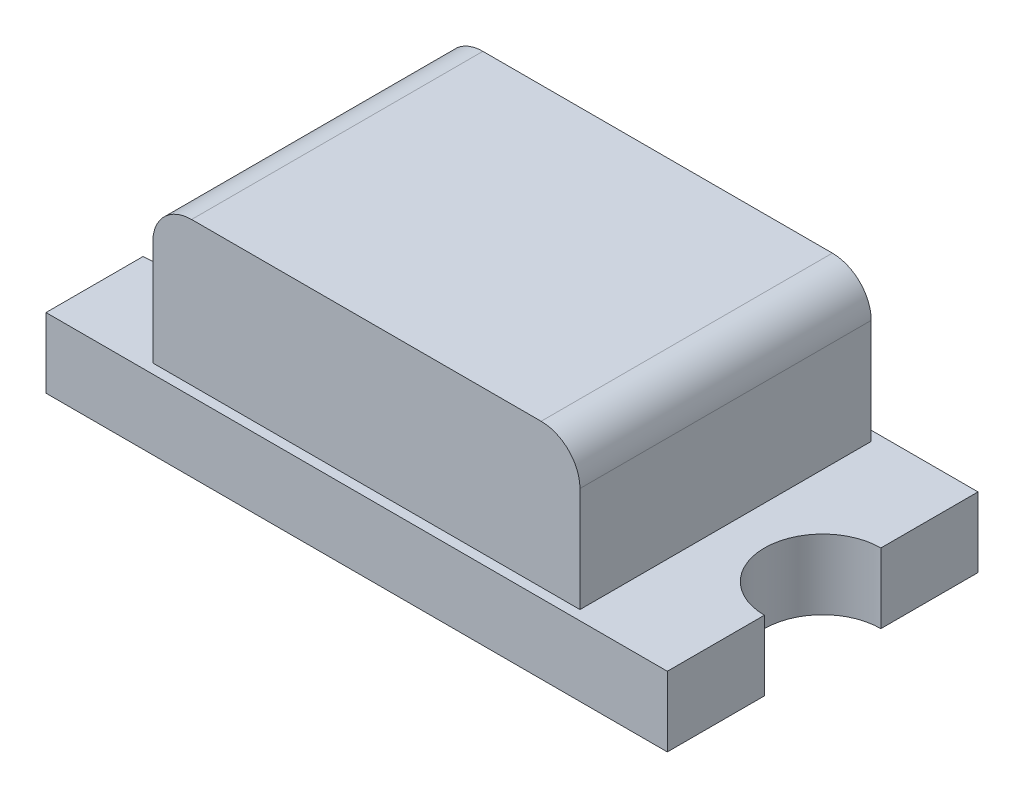
ISO-10303-21;
HEADER;
FILE_DESCRIPTION(('STEP AP214'),'2;1');
FILE_NAME('part.step','',(''),(''),'','','');
FILE_SCHEMA(('AUTOMOTIVE_DESIGN { 1 0 10303 214 1 1 1 1 }'));
ENDSEC;
DATA;
#1=APPLICATION_CONTEXT('core data for automotive mechanical design processes');
#2=APPLICATION_PROTOCOL_DEFINITION('international standard','automotive_design',2000,#1);
#3=PRODUCT_CONTEXT('',#1,'mechanical');
#4=PRODUCT('Part','Part','',(#3));
#5=PRODUCT_RELATED_PRODUCT_CATEGORY('part','',(#4));
#6=PRODUCT_DEFINITION_FORMATION('','',#4);
#7=PRODUCT_DEFINITION_CONTEXT('part definition',#1,'design');
#8=PRODUCT_DEFINITION('design','',#6,#7);
#9=PRODUCT_DEFINITION_SHAPE('','',#8);
#10=(LENGTH_UNIT() NAMED_UNIT(*) SI_UNIT(.MILLI.,.METRE.));
#11=(NAMED_UNIT(*) PLANE_ANGLE_UNIT() SI_UNIT($,.RADIAN.));
#12=(NAMED_UNIT(*) SI_UNIT($,.STERADIAN.) SOLID_ANGLE_UNIT());
#13=UNCERTAINTY_MEASURE_WITH_UNIT(LENGTH_MEASURE(1.E-05),#10,'distance_accuracy_value','');
#14=(GEOMETRIC_REPRESENTATION_CONTEXT(3) GLOBAL_UNCERTAINTY_ASSIGNED_CONTEXT((#13)) GLOBAL_UNIT_ASSIGNED_CONTEXT((#10,
#11,#12)) REPRESENTATION_CONTEXT('',''));
#15=CARTESIAN_POINT('',(0.,0.,0.));
#16=DIRECTION('',(0.,0.,1.));
#17=DIRECTION('',(1.,0.,0.));
#18=AXIS2_PLACEMENT_3D('',#15,#16,#17);
#19=CARTESIAN_POINT('',(0.,0.18,0.));
#20=DIRECTION('',(0.,-1.,0.));
#21=DIRECTION('',(0.,0.,-1.));
#22=AXIS2_PLACEMENT_3D('',#19,#20,#21);
#23=PLANE('',#22);
#24=CARTESIAN_POINT('',(0.8,0.18,0.));
#25=DIRECTION('',(0.,-1.,0.));
#26=DIRECTION('',(0.,0.,-1.));
#27=AXIS2_PLACEMENT_3D('',#24,#25,#26);
#28=CIRCLE('',#27,0.15);
#29=CARTESIAN_POINT('',(0.8,0.18,0.15));
#30=VERTEX_POINT('',#29);
#31=CARTESIAN_POINT('',(0.8,0.18,-0.15));
#32=VERTEX_POINT('',#31);
#33=EDGE_CURVE('E166',#30,#32,#28,.T.);
#34=ORIENTED_EDGE('',*,*,#33,.T.);
#35=DIRECTION('',(0.,0.,-1.));
#36=VECTOR('',#35,1.);
#37=CARTESIAN_POINT('',(0.8,0.18,0.4));
#38=LINE('',#37,#36);
#39=CARTESIAN_POINT('',(0.8,0.18,-0.4));
#40=VERTEX_POINT('',#39);
#41=EDGE_CURVE('E191',#32,#40,#38,.T.);
#42=ORIENTED_EDGE('',*,*,#41,.T.);
#43=DIRECTION('',(-1.,0.,0.));
#44=VECTOR('',#43,1.);
#45=CARTESIAN_POINT('',(-0.8,0.18,-0.4));
#46=LINE('',#45,#44);
#47=CARTESIAN_POINT('',(-0.8,0.18,-0.4));
#48=VERTEX_POINT('',#47);
#49=EDGE_CURVE('E190',#40,#48,#46,.T.);
#50=ORIENTED_EDGE('',*,*,#49,.T.);
#51=DIRECTION('',(0.,0.,1.));
#52=VECTOR('',#51,1.);
#53=CARTESIAN_POINT('',(-0.8,0.18,0.4));
#54=LINE('',#53,#52);
#55=CARTESIAN_POINT('',(-0.8,0.18,-0.15));
#56=VERTEX_POINT('',#55);
#57=EDGE_CURVE('E194',#48,#56,#54,.T.);
#58=ORIENTED_EDGE('',*,*,#57,.T.);
#59=CARTESIAN_POINT('',(-0.8,0.18,0.));
#60=DIRECTION('',(0.,1.,0.));
#61=DIRECTION('',(0.,0.,-1.));
#62=AXIS2_PLACEMENT_3D('',#59,#60,#61);
#63=CIRCLE('',#62,0.15);
#64=CARTESIAN_POINT('',(-0.8,0.18,0.15));
#65=VERTEX_POINT('',#64);
#66=EDGE_CURVE('E174',#65,#56,#63,.T.);
#67=ORIENTED_EDGE('',*,*,#66,.F.);
#68=CARTESIAN_POINT('',(-0.8,0.18,0.4));
#69=VERTEX_POINT('',#68);
#70=EDGE_CURVE('E193',#65,#69,#54,.T.);
#71=ORIENTED_EDGE('',*,*,#70,.T.);
#72=DIRECTION('',(1.,0.,0.));
#73=VECTOR('',#72,1.);
#74=CARTESIAN_POINT('',(-0.8,0.18,0.4));
#75=LINE('',#74,#73);
#76=CARTESIAN_POINT('',(0.8,0.18,0.4));
#77=VERTEX_POINT('',#76);
#78=EDGE_CURVE('E197',#69,#77,#75,.T.);
#79=ORIENTED_EDGE('',*,*,#78,.T.);
#80=EDGE_CURVE('E187',#77,#30,#38,.T.);
#81=ORIENTED_EDGE('',*,*,#80,.T.);
#82=EDGE_LOOP('',(#34,#42,#50,#58,#67,#71,#79,#81));
#83=FACE_BOUND('',#82,.T.);
#84=DIRECTION('',(0.,0.,-1.));
#85=VECTOR('',#84,1.);
#86=CARTESIAN_POINT('',(0.55,0.18,0.375));
#87=LINE('',#86,#85);
#88=CARTESIAN_POINT('',(0.55,0.18,0.375));
#89=VERTEX_POINT('',#88);
#90=CARTESIAN_POINT('',(0.55,0.18,-0.375));
#91=VERTEX_POINT('',#90);
#92=EDGE_CURVE('E137',#89,#91,#87,.T.);
#93=ORIENTED_EDGE('',*,*,#92,.F.);
#94=DIRECTION('',(1.,0.,0.));
#95=VECTOR('',#94,1.);
#96=CARTESIAN_POINT('',(-0.55,0.18,0.375));
#97=LINE('',#96,#95);
#98=CARTESIAN_POINT('',(-0.55,0.18,0.375));
#99=VERTEX_POINT('',#98);
#100=EDGE_CURVE('E147',#99,#89,#97,.T.);
#101=ORIENTED_EDGE('',*,*,#100,.F.);
#102=DIRECTION('',(0.,0.,1.));
#103=VECTOR('',#102,1.);
#104=CARTESIAN_POINT('',(-0.55,0.18,0.375));
#105=LINE('',#104,#103);
#106=CARTESIAN_POINT('',(-0.55,0.18,-0.375));
#107=VERTEX_POINT('',#106);
#108=EDGE_CURVE('E154',#107,#99,#105,.T.);
#109=ORIENTED_EDGE('',*,*,#108,.F.);
#110=DIRECTION('',(-1.,0.,0.));
#111=VECTOR('',#110,1.);
#112=CARTESIAN_POINT('',(-0.55,0.18,-0.375));
#113=LINE('',#112,#111);
#114=EDGE_CURVE('E150',#91,#107,#113,.T.);
#115=ORIENTED_EDGE('',*,*,#114,.F.);
#116=EDGE_LOOP('',(#93,#101,#109,#115));
#117=FACE_BOUND('',#116,.T.);
#118=ADVANCED_FACE('F35',(#83,#117),#23,.F.);
#119=CARTESIAN_POINT('',(0.8,0.18,0.4));
#120=DIRECTION('',(-1.,0.,0.));
#121=DIRECTION('',(0.,0.,1.));
#122=AXIS2_PLACEMENT_3D('',#119,#120,#121);
#123=PLANE('',#122);
#124=DIRECTION('',(0.,1.,0.));
#125=VECTOR('',#124,1.);
#126=CARTESIAN_POINT('',(0.8,0.,0.15));
#127=LINE('',#126,#125);
#128=CARTESIAN_POINT('',(0.8,0.,0.15));
#129=VERTEX_POINT('',#128);
#130=EDGE_CURVE('E169',#129,#30,#127,.T.);
#131=ORIENTED_EDGE('',*,*,#130,.T.);
#132=ORIENTED_EDGE('',*,*,#80,.F.);
#133=DIRECTION('',(0.,-1.,0.));
#134=VECTOR('',#133,1.);
#135=CARTESIAN_POINT('',(0.8,0.18,0.4));
#136=LINE('',#135,#134);
#137=CARTESIAN_POINT('',(0.8,0.,0.4));
#138=VERTEX_POINT('',#137);
#139=EDGE_CURVE('E199',#77,#138,#136,.T.);
#140=ORIENTED_EDGE('',*,*,#139,.T.);
#141=DIRECTION('',(0.,0.,-1.));
#142=VECTOR('',#141,1.);
#143=CARTESIAN_POINT('',(0.8,0.,0.4));
#144=LINE('',#143,#142);
#145=EDGE_CURVE('E200',#138,#129,#144,.T.);
#146=ORIENTED_EDGE('',*,*,#145,.T.);
#147=EDGE_LOOP('',(#131,#132,#140,#146));
#148=FACE_BOUND('',#147,.T.);
#149=ADVANCED_FACE('F259',(#148),#123,.F.);
#150=DIRECTION('',(0.,1.,0.));
#151=VECTOR('',#150,1.);
#152=CARTESIAN_POINT('',(0.8,0.,-0.15));
#153=LINE('',#152,#151);
#154=CARTESIAN_POINT('',(0.8,0.,-0.15));
#155=VERTEX_POINT('',#154);
#156=EDGE_CURVE('E172',#155,#32,#153,.T.);
#157=ORIENTED_EDGE('',*,*,#156,.F.);
#158=CARTESIAN_POINT('',(0.8,0.,-0.4));
#159=VERTEX_POINT('',#158);
#160=EDGE_CURVE('E184',#155,#159,#144,.T.);
#161=ORIENTED_EDGE('',*,*,#160,.T.);
#162=DIRECTION('',(0.,-1.,0.));
#163=VECTOR('',#162,1.);
#164=CARTESIAN_POINT('',(0.8,0.18,-0.4));
#165=LINE('',#164,#163);
#166=EDGE_CURVE('E219',#40,#159,#165,.T.);
#167=ORIENTED_EDGE('',*,*,#166,.F.);
#168=ORIENTED_EDGE('',*,*,#41,.F.);
#169=EDGE_LOOP('',(#157,#161,#167,#168));
#170=FACE_BOUND('',#169,.T.);
#171=ADVANCED_FACE('F265',(#170),#123,.F.);
#172=CARTESIAN_POINT('',(0.,0.,0.));
#173=DIRECTION('',(0.,-1.,0.));
#174=DIRECTION('',(0.,0.,-1.));
#175=AXIS2_PLACEMENT_3D('',#172,#173,#174);
#176=PLANE('',#175);
#177=ORIENTED_EDGE('',*,*,#160,.F.);
#178=CARTESIAN_POINT('',(0.8,0.,0.));
#179=DIRECTION('',(0.,-1.,0.));
#180=DIRECTION('',(0.,0.,-1.));
#181=AXIS2_PLACEMENT_3D('',#178,#179,#180);
#182=CIRCLE('',#181,0.15);
#183=EDGE_CURVE('E167',#129,#155,#182,.T.);
#184=ORIENTED_EDGE('',*,*,#183,.F.);
#185=ORIENTED_EDGE('',*,*,#145,.F.);
#186=DIRECTION('',(1.,0.,0.));
#187=VECTOR('',#186,1.);
#188=CARTESIAN_POINT('',(-0.8,0.,0.4));
#189=LINE('',#188,#187);
#190=CARTESIAN_POINT('',(-0.8,0.,0.4));
#191=VERTEX_POINT('',#190);
#192=EDGE_CURVE('E209',#191,#138,#189,.T.);
#193=ORIENTED_EDGE('',*,*,#192,.F.);
#194=DIRECTION('',(0.,0.,1.));
#195=VECTOR('',#194,1.);
#196=CARTESIAN_POINT('',(-0.8,0.,0.4));
#197=LINE('',#196,#195);
#198=CARTESIAN_POINT('',(-0.8,0.,0.15));
#199=VERTEX_POINT('',#198);
#200=EDGE_CURVE('E205',#199,#191,#197,.T.);
#201=ORIENTED_EDGE('',*,*,#200,.F.);
#202=CARTESIAN_POINT('',(-0.8,0.,0.));
#203=DIRECTION('',(0.,1.,0.));
#204=DIRECTION('',(0.,0.,-1.));
#205=AXIS2_PLACEMENT_3D('',#202,#203,#204);
#206=CIRCLE('',#205,0.15);
#207=CARTESIAN_POINT('',(-0.8,0.,-0.15));
#208=VERTEX_POINT('',#207);
#209=EDGE_CURVE('E177',#199,#208,#206,.T.);
#210=ORIENTED_EDGE('',*,*,#209,.T.);
#211=CARTESIAN_POINT('',(-0.8,0.,-0.4));
#212=VERTEX_POINT('',#211);
#213=EDGE_CURVE('E206',#212,#208,#197,.T.);
#214=ORIENTED_EDGE('',*,*,#213,.F.);
#215=DIRECTION('',(-1.,0.,0.));
#216=VECTOR('',#215,1.);
#217=CARTESIAN_POINT('',(-0.8,0.,-0.4));
#218=LINE('',#217,#216);
#219=EDGE_CURVE('E203',#159,#212,#218,.T.);
#220=ORIENTED_EDGE('',*,*,#219,.F.);
#221=EDGE_LOOP('',(#177,#184,#185,#193,#201,#210,#214,#220));
#222=FACE_BOUND('',#221,.T.);
#223=ADVANCED_FACE('F272',(#222),#176,.T.);
#224=CARTESIAN_POINT('',(-0.8,0.18,0.4));
#225=DIRECTION('',(1.,0.,0.));
#226=DIRECTION('',(0.,0.,-1.));
#227=AXIS2_PLACEMENT_3D('',#224,#225,#226);
#228=PLANE('',#227);
#229=ORIENTED_EDGE('',*,*,#213,.T.);
#230=DIRECTION('',(0.,1.,0.));
#231=VECTOR('',#230,1.);
#232=CARTESIAN_POINT('',(-0.8,0.,-0.15));
#233=LINE('',#232,#231);
#234=EDGE_CURVE('E180',#208,#56,#233,.T.);
#235=ORIENTED_EDGE('',*,*,#234,.T.);
#236=ORIENTED_EDGE('',*,*,#57,.F.);
#237=DIRECTION('',(0.,-1.,0.));
#238=VECTOR('',#237,1.);
#239=CARTESIAN_POINT('',(-0.8,0.18,-0.4));
#240=LINE('',#239,#238);
#241=EDGE_CURVE('E216',#48,#212,#240,.T.);
#242=ORIENTED_EDGE('',*,*,#241,.T.);
#243=EDGE_LOOP('',(#229,#235,#236,#242));
#244=FACE_BOUND('',#243,.T.);
#245=ADVANCED_FACE('F275',(#244),#228,.F.);
#246=CARTESIAN_POINT('',(-0.8,0.18,-0.4));
#247=DIRECTION('',(0.,0.,1.));
#248=DIRECTION('',(1.,0.,0.));
#249=AXIS2_PLACEMENT_3D('',#246,#247,#248);
#250=PLANE('',#249);
#251=ORIENTED_EDGE('',*,*,#219,.T.);
#252=ORIENTED_EDGE('',*,*,#241,.F.);
#253=ORIENTED_EDGE('',*,*,#49,.F.);
#254=ORIENTED_EDGE('',*,*,#166,.T.);
#255=EDGE_LOOP('',(#251,#252,#253,#254));
#256=FACE_BOUND('',#255,.T.);
#257=ADVANCED_FACE('F284',(#256),#250,.F.);
#258=ORIENTED_EDGE('',*,*,#70,.F.);
#259=DIRECTION('',(0.,1.,0.));
#260=VECTOR('',#259,1.);
#261=CARTESIAN_POINT('',(-0.8,0.,0.15));
#262=LINE('',#261,#260);
#263=EDGE_CURVE('E182',#199,#65,#262,.T.);
#264=ORIENTED_EDGE('',*,*,#263,.F.);
#265=ORIENTED_EDGE('',*,*,#200,.T.);
#266=DIRECTION('',(0.,-1.,0.));
#267=VECTOR('',#266,1.);
#268=CARTESIAN_POINT('',(-0.8,0.18,0.4));
#269=LINE('',#268,#267);
#270=EDGE_CURVE('E213',#69,#191,#269,.T.);
#271=ORIENTED_EDGE('',*,*,#270,.F.);
#272=EDGE_LOOP('',(#258,#264,#265,#271));
#273=FACE_BOUND('',#272,.T.);
#274=ADVANCED_FACE('F280',(#273),#228,.F.);
#275=CARTESIAN_POINT('',(-0.8,0.18,0.4));
#276=DIRECTION('',(0.,0.,-1.));
#277=DIRECTION('',(-1.,0.,0.));
#278=AXIS2_PLACEMENT_3D('',#275,#276,#277);
#279=PLANE('',#278);
#280=ORIENTED_EDGE('',*,*,#192,.T.);
#281=ORIENTED_EDGE('',*,*,#139,.F.);
#282=ORIENTED_EDGE('',*,*,#78,.F.);
#283=ORIENTED_EDGE('',*,*,#270,.T.);
#284=EDGE_LOOP('',(#280,#281,#282,#283));
#285=FACE_BOUND('',#284,.T.);
#286=ADVANCED_FACE('F277',(#285),#279,.F.);
#287=CARTESIAN_POINT('',(-0.8,0.,0.));
#288=DIRECTION('',(0.,1.,0.));
#289=DIRECTION('',(0.,0.,1.));
#290=AXIS2_PLACEMENT_3D('',#287,#288,#289);
#291=CYLINDRICAL_SURFACE('',#290,0.15);
#292=ORIENTED_EDGE('',*,*,#66,.T.);
#293=ORIENTED_EDGE('',*,*,#234,.F.);
#294=ORIENTED_EDGE('',*,*,#209,.F.);
#295=ORIENTED_EDGE('',*,*,#263,.T.);
#296=EDGE_LOOP('',(#292,#293,#294,#295));
#297=FACE_BOUND('',#296,.T.);
#298=ADVANCED_FACE('F270',(#297),#291,.F.);
#299=CARTESIAN_POINT('',(0.8,0.,0.));
#300=DIRECTION('',(0.,1.,0.));
#301=DIRECTION('',(0.,0.,1.));
#302=AXIS2_PLACEMENT_3D('',#299,#300,#301);
#303=CYLINDRICAL_SURFACE('',#302,0.15);
#304=ORIENTED_EDGE('',*,*,#33,.F.);
#305=ORIENTED_EDGE('',*,*,#130,.F.);
#306=ORIENTED_EDGE('',*,*,#183,.T.);
#307=ORIENTED_EDGE('',*,*,#156,.T.);
#308=EDGE_LOOP('',(#304,#305,#306,#307));
#309=FACE_BOUND('',#308,.T.);
#310=ADVANCED_FACE('F380',(#309),#303,.F.);
#311=CARTESIAN_POINT('',(0.55,0.55,0.375));
#312=DIRECTION('',(-1.,0.,0.));
#313=DIRECTION('',(0.,0.,1.));
#314=AXIS2_PLACEMENT_3D('',#311,#312,#313);
#315=PLANE('',#314);
#316=DIRECTION('',(0.,-1.,0.));
#317=VECTOR('',#316,1.);
#318=CARTESIAN_POINT('',(0.55,0.55,-0.375));
#319=LINE('',#318,#317);
#320=CARTESIAN_POINT('',(0.55,0.45,-0.375));
#321=VERTEX_POINT('',#320);
#322=EDGE_CURVE('E164',#321,#91,#319,.T.);
#323=ORIENTED_EDGE('',*,*,#322,.F.);
#324=DIRECTION('',(0.,0.,-1.));
#325=VECTOR('',#324,1.);
#326=CARTESIAN_POINT('',(0.55,0.45,0.375));
#327=LINE('',#326,#325);
#328=CARTESIAN_POINT('',(0.55,0.45,0.375));
#329=VERTEX_POINT('',#328);
#330=EDGE_CURVE('E58',#321,#329,#327,.F.);
#331=ORIENTED_EDGE('',*,*,#330,.T.);
#332=DIRECTION('',(0.,-1.,0.));
#333=VECTOR('',#332,1.);
#334=CARTESIAN_POINT('',(0.55,0.55,0.375));
#335=LINE('',#334,#333);
#336=EDGE_CURVE('E134',#329,#89,#335,.T.);
#337=ORIENTED_EDGE('',*,*,#336,.T.);
#338=ORIENTED_EDGE('',*,*,#92,.T.);
#339=EDGE_LOOP('',(#323,#331,#337,#338));
#340=FACE_BOUND('',#339,.T.);
#341=ADVANCED_FACE('F136',(#340),#315,.F.);
#342=CARTESIAN_POINT('',(-0.55,0.55,-0.375));
#343=DIRECTION('',(0.,0.,1.));
#344=DIRECTION('',(1.,0.,0.));
#345=AXIS2_PLACEMENT_3D('',#342,#343,#344);
#346=PLANE('',#345);
#347=DIRECTION('',(-1.,0.,0.));
#348=VECTOR('',#347,1.);
#349=CARTESIAN_POINT('',(-0.55,0.55,-0.375));
#350=LINE('',#349,#348);
#351=CARTESIAN_POINT('',(0.45,0.55,-0.375));
#352=VERTEX_POINT('',#351);
#353=CARTESIAN_POINT('',(-0.45,0.55,-0.375));
#354=VERTEX_POINT('',#353);
#355=EDGE_CURVE('E153',#352,#354,#350,.T.);
#356=ORIENTED_EDGE('',*,*,#355,.F.);
#357=CARTESIAN_POINT('',(0.45,0.45,-0.375));
#358=DIRECTION('',(0.,0.,1.));
#359=DIRECTION('',(1.,0.,0.));
#360=AXIS2_PLACEMENT_3D('',#357,#358,#359);
#361=CIRCLE('',#360,0.1);
#362=EDGE_CURVE('E230',#352,#321,#361,.F.);
#363=ORIENTED_EDGE('',*,*,#362,.T.);
#364=ORIENTED_EDGE('',*,*,#322,.T.);
#365=ORIENTED_EDGE('',*,*,#114,.T.);
#366=DIRECTION('',(0.,-1.,0.));
#367=VECTOR('',#366,1.);
#368=CARTESIAN_POINT('',(-0.55,0.55,-0.375));
#369=LINE('',#368,#367);
#370=CARTESIAN_POINT('',(-0.55,0.45,-0.375));
#371=VERTEX_POINT('',#370);
#372=EDGE_CURVE('E162',#371,#107,#369,.T.);
#373=ORIENTED_EDGE('',*,*,#372,.F.);
#374=CARTESIAN_POINT('',(-0.45,0.45,-0.375));
#375=DIRECTION('',(0.,0.,1.));
#376=DIRECTION('',(1.,0.,0.));
#377=AXIS2_PLACEMENT_3D('',#374,#375,#376);
#378=CIRCLE('',#377,0.1);
#379=EDGE_CURVE('E228',#371,#354,#378,.F.);
#380=ORIENTED_EDGE('',*,*,#379,.T.);
#381=EDGE_LOOP('',(#356,#363,#364,#365,#373,#380));
#382=FACE_BOUND('',#381,.T.);
#383=ADVANCED_FACE('F243',(#382),#346,.F.);
#384=CARTESIAN_POINT('',(-0.55,0.55,0.375));
#385=DIRECTION('',(1.,0.,0.));
#386=DIRECTION('',(0.,0.,-1.));
#387=AXIS2_PLACEMENT_3D('',#384,#385,#386);
#388=PLANE('',#387);
#389=DIRECTION('',(0.,-1.,0.));
#390=VECTOR('',#389,1.);
#391=CARTESIAN_POINT('',(-0.55,0.55,0.375));
#392=LINE('',#391,#390);
#393=CARTESIAN_POINT('',(-0.55,0.45,0.375));
#394=VERTEX_POINT('',#393);
#395=EDGE_CURVE('E140',#394,#99,#392,.T.);
#396=ORIENTED_EDGE('',*,*,#395,.F.);
#397=DIRECTION('',(0.,0.,1.));
#398=VECTOR('',#397,1.);
#399=CARTESIAN_POINT('',(-0.55,0.45,0.375));
#400=LINE('',#399,#398);
#401=EDGE_CURVE('E11',#394,#371,#400,.F.);
#402=ORIENTED_EDGE('',*,*,#401,.T.);
#403=ORIENTED_EDGE('',*,*,#372,.T.);
#404=ORIENTED_EDGE('',*,*,#108,.T.);
#405=EDGE_LOOP('',(#396,#402,#403,#404));
#406=FACE_BOUND('',#405,.T.);
#407=ADVANCED_FACE('F249',(#406),#388,.F.);
#408=CARTESIAN_POINT('',(-0.55,0.55,0.375));
#409=DIRECTION('',(0.,0.,-1.));
#410=DIRECTION('',(-1.,0.,0.));
#411=AXIS2_PLACEMENT_3D('',#408,#409,#410);
#412=PLANE('',#411);
#413=ORIENTED_EDGE('',*,*,#336,.F.);
#414=CARTESIAN_POINT('',(0.45,0.45,0.375));
#415=DIRECTION('',(0.,0.,-1.));
#416=DIRECTION('',(-1.,0.,0.));
#417=AXIS2_PLACEMENT_3D('',#414,#415,#416);
#418=CIRCLE('',#417,0.1);
#419=CARTESIAN_POINT('',(0.45,0.55,0.375));
#420=VERTEX_POINT('',#419);
#421=EDGE_CURVE('E43',#329,#420,#418,.F.);
#422=ORIENTED_EDGE('',*,*,#421,.T.);
#423=DIRECTION('',(1.,0.,0.));
#424=VECTOR('',#423,1.);
#425=CARTESIAN_POINT('',(-0.55,0.55,0.375));
#426=LINE('',#425,#424);
#427=CARTESIAN_POINT('',(-0.45,0.55,0.375));
#428=VERTEX_POINT('',#427);
#429=EDGE_CURVE('E141',#428,#420,#426,.T.);
#430=ORIENTED_EDGE('',*,*,#429,.F.);
#431=CARTESIAN_POINT('',(-0.45,0.45,0.375));
#432=DIRECTION('',(0.,0.,-1.));
#433=DIRECTION('',(-1.,0.,0.));
#434=AXIS2_PLACEMENT_3D('',#431,#432,#433);
#435=CIRCLE('',#434,0.1);
#436=EDGE_CURVE('E50',#428,#394,#435,.F.);
#437=ORIENTED_EDGE('',*,*,#436,.T.);
#438=ORIENTED_EDGE('',*,*,#395,.T.);
#439=ORIENTED_EDGE('',*,*,#100,.T.);
#440=EDGE_LOOP('',(#413,#422,#430,#437,#438,#439));
#441=FACE_BOUND('',#440,.T.);
#442=ADVANCED_FACE('F152',(#441),#412,.F.);
#443=CARTESIAN_POINT('',(0.,0.55,0.));
#444=DIRECTION('',(0.,-1.,0.));
#445=DIRECTION('',(0.,0.,-1.));
#446=AXIS2_PLACEMENT_3D('',#443,#444,#445);
#447=PLANE('',#446);
#448=ORIENTED_EDGE('',*,*,#429,.T.);
#449=DIRECTION('',(0.,0.,-1.));
#450=VECTOR('',#449,1.);
#451=CARTESIAN_POINT('',(0.45,0.55,0.));
#452=LINE('',#451,#450);
#453=EDGE_CURVE('E225',#420,#352,#452,.T.);
#454=ORIENTED_EDGE('',*,*,#453,.T.);
#455=ORIENTED_EDGE('',*,*,#355,.T.);
#456=DIRECTION('',(0.,0.,1.));
#457=VECTOR('',#456,1.);
#458=CARTESIAN_POINT('',(-0.45,0.55,0.));
#459=LINE('',#458,#457);
#460=EDGE_CURVE('E222',#354,#428,#459,.T.);
#461=ORIENTED_EDGE('',*,*,#460,.T.);
#462=EDGE_LOOP('',(#448,#454,#455,#461));
#463=FACE_BOUND('',#462,.T.);
#464=ADVANCED_FACE('F237',(#463),#447,.F.);
#465=CARTESIAN_POINT('',(0.45,0.45,0.));
#466=DIRECTION('',(0.,0.,-1.));
#467=DIRECTION('',(-1.,0.,0.));
#468=AXIS2_PLACEMENT_3D('',#465,#466,#467);
#469=CYLINDRICAL_SURFACE('',#468,0.1);
#470=ORIENTED_EDGE('',*,*,#421,.F.);
#471=ORIENTED_EDGE('',*,*,#330,.F.);
#472=ORIENTED_EDGE('',*,*,#362,.F.);
#473=ORIENTED_EDGE('',*,*,#453,.F.);
#474=EDGE_LOOP('',(#470,#471,#472,#473));
#475=FACE_BOUND('',#474,.T.);
#476=ADVANCED_FACE('F241',(#475),#469,.T.);
#477=CARTESIAN_POINT('',(-0.45,0.45,0.));
#478=DIRECTION('',(0.,0.,1.));
#479=DIRECTION('',(1.,0.,0.));
#480=AXIS2_PLACEMENT_3D('',#477,#478,#479);
#481=CYLINDRICAL_SURFACE('',#480,0.1);
#482=ORIENTED_EDGE('',*,*,#379,.F.);
#483=ORIENTED_EDGE('',*,*,#401,.F.);
#484=ORIENTED_EDGE('',*,*,#436,.F.);
#485=ORIENTED_EDGE('',*,*,#460,.F.);
#486=EDGE_LOOP('',(#482,#483,#484,#485));
#487=FACE_BOUND('',#486,.T.);
#488=ADVANCED_FACE('F37',(#487),#481,.T.);
#489=CLOSED_SHELL('',(#118,#149,#171,#223,#245,#257,#274,#286,#298,#310,#341,#383,#407,#442,
#464,#476,#488));
#490=MANIFOLD_SOLID_BREP('B2',#489);
#491=ADVANCED_BREP_SHAPE_REPRESENTATION('',(#18,#490),#14);
#492=SHAPE_DEFINITION_REPRESENTATION(#9,#491);
ENDSEC;
END-ISO-10303-21;
